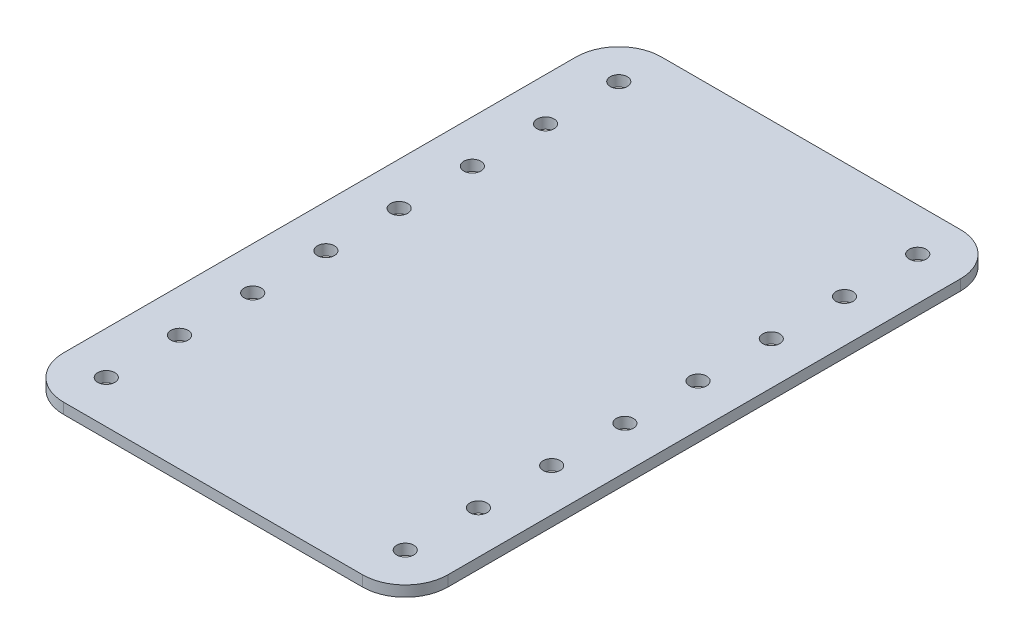
ISO-10303-21;
HEADER;
FILE_DESCRIPTION(('STEP AP214'),'2;1');
FILE_NAME('part.step','',(''),(''),'','','');
FILE_SCHEMA(('AUTOMOTIVE_DESIGN { 1 0 10303 214 1 1 1 1 }'));
ENDSEC;
DATA;
#1=APPLICATION_CONTEXT('core data for automotive mechanical design processes');
#2=APPLICATION_PROTOCOL_DEFINITION('international standard','automotive_design',2000,#1);
#3=PRODUCT_CONTEXT('',#1,'mechanical');
#4=PRODUCT('Part','Part','',(#3));
#5=PRODUCT_RELATED_PRODUCT_CATEGORY('part','',(#4));
#6=PRODUCT_DEFINITION_FORMATION('','',#4);
#7=PRODUCT_DEFINITION_CONTEXT('part definition',#1,'design');
#8=PRODUCT_DEFINITION('design','',#6,#7);
#9=PRODUCT_DEFINITION_SHAPE('','',#8);
#10=(LENGTH_UNIT() NAMED_UNIT(*) SI_UNIT(.MILLI.,.METRE.));
#11=(NAMED_UNIT(*) PLANE_ANGLE_UNIT() SI_UNIT($,.RADIAN.));
#12=(NAMED_UNIT(*) SI_UNIT($,.STERADIAN.) SOLID_ANGLE_UNIT());
#13=UNCERTAINTY_MEASURE_WITH_UNIT(LENGTH_MEASURE(1.E-05),#10,'distance_accuracy_value','');
#14=(GEOMETRIC_REPRESENTATION_CONTEXT(3) GLOBAL_UNCERTAINTY_ASSIGNED_CONTEXT((#13)) GLOBAL_UNIT_ASSIGNED_CONTEXT((#10,
#11,#12)) REPRESENTATION_CONTEXT('',''));
#15=CARTESIAN_POINT('',(0.,0.,0.));
#16=DIRECTION('',(0.,0.,1.));
#17=DIRECTION('',(1.,0.,0.));
#18=AXIS2_PLACEMENT_3D('',#15,#16,#17);
#19=CARTESIAN_POINT('',(57.15,3.175,88.9));
#20=DIRECTION('',(-1.,0.,0.));
#21=DIRECTION('',(0.,0.,1.));
#22=AXIS2_PLACEMENT_3D('',#19,#20,#21);
#23=PLANE('',#22);
#24=DIRECTION('',(0.,0.,-1.));
#25=VECTOR('',#24,1.);
#26=CARTESIAN_POINT('',(57.15,0.,88.9));
#27=LINE('',#26,#25);
#28=CARTESIAN_POINT('',(57.15,0.,76.2));
#29=VERTEX_POINT('',#28);
#30=CARTESIAN_POINT('',(57.15,0.,-76.2));
#31=VERTEX_POINT('',#30);
#32=EDGE_CURVE('E127',#29,#31,#27,.T.);
#33=ORIENTED_EDGE('',*,*,#32,.T.);
#34=DIRECTION('',(0.,-1.,0.));
#35=VECTOR('',#34,1.);
#36=CARTESIAN_POINT('',(57.15,3.175,-76.2));
#37=LINE('',#36,#35);
#38=CARTESIAN_POINT('',(57.15,3.175,-76.2));
#39=VERTEX_POINT('',#38);
#40=EDGE_CURVE('E150',#31,#39,#37,.F.);
#41=ORIENTED_EDGE('',*,*,#40,.T.);
#42=DIRECTION('',(0.,0.,-1.));
#43=VECTOR('',#42,1.);
#44=CARTESIAN_POINT('',(57.15,3.175,88.9));
#45=LINE('',#44,#43);
#46=CARTESIAN_POINT('',(57.15,3.175,76.2));
#47=VERTEX_POINT('',#46);
#48=EDGE_CURVE('E125',#47,#39,#45,.T.);
#49=ORIENTED_EDGE('',*,*,#48,.F.);
#50=DIRECTION('',(0.,-1.,0.));
#51=VECTOR('',#50,1.);
#52=CARTESIAN_POINT('',(57.15,3.175,76.2));
#53=LINE('',#52,#51);
#54=EDGE_CURVE('E147',#47,#29,#53,.T.);
#55=ORIENTED_EDGE('',*,*,#54,.T.);
#56=EDGE_LOOP('',(#33,#41,#49,#55));
#57=FACE_BOUND('',#56,.T.);
#58=ADVANCED_FACE('F32',(#57),#23,.F.);
#59=CARTESIAN_POINT('',(-57.15,3.175,-88.9));
#60=DIRECTION('',(0.,0.,1.));
#61=DIRECTION('',(1.,0.,0.));
#62=AXIS2_PLACEMENT_3D('',#59,#60,#61);
#63=PLANE('',#62);
#64=DIRECTION('',(-1.,0.,0.));
#65=VECTOR('',#64,1.);
#66=CARTESIAN_POINT('',(-57.15,0.,-88.9));
#67=LINE('',#66,#65);
#68=CARTESIAN_POINT('',(44.45,0.,-88.9));
#69=VERTEX_POINT('',#68);
#70=CARTESIAN_POINT('',(-44.45,0.,-88.9));
#71=VERTEX_POINT('',#70);
#72=EDGE_CURVE('E123',#69,#71,#67,.T.);
#73=ORIENTED_EDGE('',*,*,#72,.T.);
#74=DIRECTION('',(0.,-1.,0.));
#75=VECTOR('',#74,1.);
#76=CARTESIAN_POINT('',(-44.45,3.175,-88.9));
#77=LINE('',#76,#75);
#78=CARTESIAN_POINT('',(-44.45,3.175,-88.9));
#79=VERTEX_POINT('',#78);
#80=EDGE_CURVE('E102',#71,#79,#77,.F.);
#81=ORIENTED_EDGE('',*,*,#80,.T.);
#82=DIRECTION('',(-1.,0.,0.));
#83=VECTOR('',#82,1.);
#84=CARTESIAN_POINT('',(-57.15,3.175,-88.9));
#85=LINE('',#84,#83);
#86=CARTESIAN_POINT('',(44.45,3.175,-88.9));
#87=VERTEX_POINT('',#86);
#88=EDGE_CURVE('E166',#87,#79,#85,.T.);
#89=ORIENTED_EDGE('',*,*,#88,.F.);
#90=DIRECTION('',(0.,-1.,0.));
#91=VECTOR('',#90,1.);
#92=CARTESIAN_POINT('',(44.45,3.175,-88.9));
#93=LINE('',#92,#91);
#94=EDGE_CURVE('E107',#87,#69,#93,.T.);
#95=ORIENTED_EDGE('',*,*,#94,.T.);
#96=EDGE_LOOP('',(#73,#81,#89,#95));
#97=FACE_BOUND('',#96,.T.);
#98=ADVANCED_FACE('F317',(#97),#63,.F.);
#99=CARTESIAN_POINT('',(-57.15,3.175,88.9));
#100=DIRECTION('',(1.,0.,0.));
#101=DIRECTION('',(0.,0.,-1.));
#102=AXIS2_PLACEMENT_3D('',#99,#100,#101);
#103=PLANE('',#102);
#104=DIRECTION('',(0.,0.,1.));
#105=VECTOR('',#104,1.);
#106=CARTESIAN_POINT('',(-57.15,3.175,88.9));
#107=LINE('',#106,#105);
#108=CARTESIAN_POINT('',(-57.15,3.175,-76.2));
#109=VERTEX_POINT('',#108);
#110=CARTESIAN_POINT('',(-57.15,3.175,76.2));
#111=VERTEX_POINT('',#110);
#112=EDGE_CURVE('E116',#109,#111,#107,.T.);
#113=ORIENTED_EDGE('',*,*,#112,.F.);
#114=DIRECTION('',(0.,-1.,0.));
#115=VECTOR('',#114,1.);
#116=CARTESIAN_POINT('',(-57.15,3.175,-76.2));
#117=LINE('',#116,#115);
#118=CARTESIAN_POINT('',(-57.15,0.,-76.2));
#119=VERTEX_POINT('',#118);
#120=EDGE_CURVE('E101',#109,#119,#117,.T.);
#121=ORIENTED_EDGE('',*,*,#120,.T.);
#122=DIRECTION('',(0.,0.,1.));
#123=VECTOR('',#122,1.);
#124=CARTESIAN_POINT('',(-57.15,0.,88.9));
#125=LINE('',#124,#123);
#126=CARTESIAN_POINT('',(-57.15,0.,76.2));
#127=VERTEX_POINT('',#126);
#128=EDGE_CURVE('E114',#119,#127,#125,.T.);
#129=ORIENTED_EDGE('',*,*,#128,.T.);
#130=DIRECTION('',(0.,-1.,0.));
#131=VECTOR('',#130,1.);
#132=CARTESIAN_POINT('',(-57.15,3.175,76.2));
#133=LINE('',#132,#131);
#134=EDGE_CURVE('E118',#127,#111,#133,.F.);
#135=ORIENTED_EDGE('',*,*,#134,.T.);
#136=EDGE_LOOP('',(#113,#121,#129,#135));
#137=FACE_BOUND('',#136,.T.);
#138=ADVANCED_FACE('F113',(#137),#103,.F.);
#139=CARTESIAN_POINT('',(-57.15,3.175,88.9));
#140=DIRECTION('',(0.,0.,-1.));
#141=DIRECTION('',(-1.,0.,0.));
#142=AXIS2_PLACEMENT_3D('',#139,#140,#141);
#143=PLANE('',#142);
#144=DIRECTION('',(1.,0.,0.));
#145=VECTOR('',#144,1.);
#146=CARTESIAN_POINT('',(-57.15,0.,88.9));
#147=LINE('',#146,#145);
#148=CARTESIAN_POINT('',(-44.45,0.,88.9));
#149=VERTEX_POINT('',#148);
#150=CARTESIAN_POINT('',(44.45,0.,88.9));
#151=VERTEX_POINT('',#150);
#152=EDGE_CURVE('E122',#149,#151,#147,.T.);
#153=ORIENTED_EDGE('',*,*,#152,.T.);
#154=DIRECTION('',(0.,-1.,0.));
#155=VECTOR('',#154,1.);
#156=CARTESIAN_POINT('',(44.45,3.175,88.9));
#157=LINE('',#156,#155);
#158=CARTESIAN_POINT('',(44.45,3.175,88.9));
#159=VERTEX_POINT('',#158);
#160=EDGE_CURVE('E11',#151,#159,#157,.F.);
#161=ORIENTED_EDGE('',*,*,#160,.T.);
#162=DIRECTION('',(1.,0.,0.));
#163=VECTOR('',#162,1.);
#164=CARTESIAN_POINT('',(-57.15,3.175,88.9));
#165=LINE('',#164,#163);
#166=CARTESIAN_POINT('',(-44.45,3.175,88.9));
#167=VERTEX_POINT('',#166);
#168=EDGE_CURVE('E131',#167,#159,#165,.T.);
#169=ORIENTED_EDGE('',*,*,#168,.F.);
#170=DIRECTION('',(0.,-1.,0.));
#171=VECTOR('',#170,1.);
#172=CARTESIAN_POINT('',(-44.45,3.175,88.9));
#173=LINE('',#172,#171);
#174=EDGE_CURVE('E40',#167,#149,#173,.T.);
#175=ORIENTED_EDGE('',*,*,#174,.T.);
#176=EDGE_LOOP('',(#153,#161,#169,#175));
#177=FACE_BOUND('',#176,.T.);
#178=ADVANCED_FACE('F153',(#177),#143,.F.);
#179=CARTESIAN_POINT('',(0.,3.175,0.));
#180=DIRECTION('',(0.,-1.,0.));
#181=DIRECTION('',(0.,0.,-1.));
#182=AXIS2_PLACEMENT_3D('',#179,#180,#181);
#183=PLANE('',#182);
#184=CARTESIAN_POINT('',(44.45,3.175,-76.2));
#185=DIRECTION('',(0.,1.,0.));
#186=DIRECTION('',(0.,0.,-1.));
#187=AXIS2_PLACEMENT_3D('',#184,#185,#186);
#188=CIRCLE('',#187,2.54);
#189=CARTESIAN_POINT('',(44.45,3.175,-78.74));
#190=VERTEX_POINT('',#189);
#191=EDGE_CURVE('E266',#190,#190,#188,.T.);
#192=ORIENTED_EDGE('',*,*,#191,.F.);
#193=EDGE_LOOP('',(#192));
#194=FACE_BOUND('',#193,.T.);
#195=CARTESIAN_POINT('',(44.4499999999998,3.175,-54.4285714285714));
#196=DIRECTION('',(0.,1.,0.));
#197=DIRECTION('',(0.,0.,-1.));
#198=AXIS2_PLACEMENT_3D('',#195,#196,#197);
#199=CIRCLE('',#198,2.53999999999999);
#200=CARTESIAN_POINT('',(44.4499999999998,3.175,-56.9685714285714));
#201=VERTEX_POINT('',#200);
#202=EDGE_CURVE('E260',#201,#201,#199,.T.);
#203=ORIENTED_EDGE('',*,*,#202,.F.);
#204=EDGE_LOOP('',(#203));
#205=FACE_BOUND('',#204,.T.);
#206=CARTESIAN_POINT('',(44.4499999999995,3.175,-32.6571428571428));
#207=DIRECTION('',(0.,1.,0.));
#208=DIRECTION('',(0.,0.,-1.));
#209=AXIS2_PLACEMENT_3D('',#206,#207,#208);
#210=CIRCLE('',#209,2.54);
#211=CARTESIAN_POINT('',(44.4499999999995,3.175,-35.1971428571428));
#212=VERTEX_POINT('',#211);
#213=EDGE_CURVE('E254',#212,#212,#210,.T.);
#214=ORIENTED_EDGE('',*,*,#213,.F.);
#215=EDGE_LOOP('',(#214));
#216=FACE_BOUND('',#215,.T.);
#217=CARTESIAN_POINT('',(44.4499999999993,3.175,-10.8857142857143));
#218=DIRECTION('',(0.,1.,0.));
#219=DIRECTION('',(0.,0.,-1.));
#220=AXIS2_PLACEMENT_3D('',#217,#218,#219);
#221=CIRCLE('',#220,2.54);
#222=CARTESIAN_POINT('',(44.4499999999993,3.175,-13.4257142857143));
#223=VERTEX_POINT('',#222);
#224=EDGE_CURVE('E248',#223,#223,#221,.T.);
#225=ORIENTED_EDGE('',*,*,#224,.F.);
#226=EDGE_LOOP('',(#225));
#227=FACE_BOUND('',#226,.T.);
#228=CARTESIAN_POINT('',(44.4499999999991,3.175,10.8857142857143));
#229=DIRECTION('',(0.,1.,0.));
#230=DIRECTION('',(0.,0.,-1.));
#231=AXIS2_PLACEMENT_3D('',#228,#229,#230);
#232=CIRCLE('',#231,2.54);
#233=CARTESIAN_POINT('',(44.4499999999991,3.175,8.34571428571429));
#234=VERTEX_POINT('',#233);
#235=EDGE_CURVE('E242',#234,#234,#232,.T.);
#236=ORIENTED_EDGE('',*,*,#235,.F.);
#237=EDGE_LOOP('',(#236));
#238=FACE_BOUND('',#237,.T.);
#239=CARTESIAN_POINT('',(44.4499999999989,3.175,32.6571428571429));
#240=DIRECTION('',(0.,1.,0.));
#241=DIRECTION('',(0.,0.,-1.));
#242=AXIS2_PLACEMENT_3D('',#239,#240,#241);
#243=CIRCLE('',#242,2.54);
#244=CARTESIAN_POINT('',(44.4499999999989,3.175,30.1171428571429));
#245=VERTEX_POINT('',#244);
#246=EDGE_CURVE('E236',#245,#245,#243,.T.);
#247=ORIENTED_EDGE('',*,*,#246,.F.);
#248=EDGE_LOOP('',(#247));
#249=FACE_BOUND('',#248,.T.);
#250=CARTESIAN_POINT('',(44.4499999999986,3.175,54.4285714285714));
#251=DIRECTION('',(0.,1.,0.));
#252=DIRECTION('',(0.,0.,-1.));
#253=AXIS2_PLACEMENT_3D('',#250,#251,#252);
#254=CIRCLE('',#253,2.54);
#255=CARTESIAN_POINT('',(44.4499999999986,3.175,51.8885714285714));
#256=VERTEX_POINT('',#255);
#257=EDGE_CURVE('E230',#256,#256,#254,.T.);
#258=ORIENTED_EDGE('',*,*,#257,.F.);
#259=EDGE_LOOP('',(#258));
#260=FACE_BOUND('',#259,.T.);
#261=CARTESIAN_POINT('',(44.4499999999983,3.175,76.2));
#262=DIRECTION('',(0.,1.,0.));
#263=DIRECTION('',(0.,0.,-1.));
#264=AXIS2_PLACEMENT_3D('',#261,#262,#263);
#265=CIRCLE('',#264,2.54);
#266=CARTESIAN_POINT('',(44.4499999999983,3.175,73.66));
#267=VERTEX_POINT('',#266);
#268=EDGE_CURVE('E224',#267,#267,#265,.T.);
#269=ORIENTED_EDGE('',*,*,#268,.F.);
#270=EDGE_LOOP('',(#269));
#271=FACE_BOUND('',#270,.T.);
#272=CARTESIAN_POINT('',(-44.4499999999983,3.175,76.2));
#273=DIRECTION('',(0.,1.,0.));
#274=DIRECTION('',(0.,0.,1.));
#275=AXIS2_PLACEMENT_3D('',#272,#273,#274);
#276=CIRCLE('',#275,2.54);
#277=CARTESIAN_POINT('',(-44.4499999999983,3.175,78.74));
#278=VERTEX_POINT('',#277);
#279=EDGE_CURVE('E218',#278,#278,#276,.T.);
#280=ORIENTED_EDGE('',*,*,#279,.F.);
#281=EDGE_LOOP('',(#280));
#282=FACE_BOUND('',#281,.T.);
#283=CARTESIAN_POINT('',(-44.4499999999986,3.175,54.4285714285714));
#284=DIRECTION('',(0.,1.,0.));
#285=DIRECTION('',(0.,0.,1.));
#286=AXIS2_PLACEMENT_3D('',#283,#284,#285);
#287=CIRCLE('',#286,2.54);
#288=CARTESIAN_POINT('',(-44.4499999999986,3.175,56.9685714285714));
#289=VERTEX_POINT('',#288);
#290=EDGE_CURVE('E212',#289,#289,#287,.T.);
#291=ORIENTED_EDGE('',*,*,#290,.F.);
#292=EDGE_LOOP('',(#291));
#293=FACE_BOUND('',#292,.T.);
#294=CARTESIAN_POINT('',(-44.4499999999989,3.175,32.6571428571429));
#295=DIRECTION('',(0.,1.,0.));
#296=DIRECTION('',(0.,0.,1.));
#297=AXIS2_PLACEMENT_3D('',#294,#295,#296);
#298=CIRCLE('',#297,2.54);
#299=CARTESIAN_POINT('',(-44.4499999999989,3.175,35.1971428571429));
#300=VERTEX_POINT('',#299);
#301=EDGE_CURVE('E206',#300,#300,#298,.T.);
#302=ORIENTED_EDGE('',*,*,#301,.F.);
#303=EDGE_LOOP('',(#302));
#304=FACE_BOUND('',#303,.T.);
#305=CARTESIAN_POINT('',(-44.4499999999991,3.175,10.8857142857143));
#306=DIRECTION('',(0.,1.,0.));
#307=DIRECTION('',(0.,0.,1.));
#308=AXIS2_PLACEMENT_3D('',#305,#306,#307);
#309=CIRCLE('',#308,2.54);
#310=CARTESIAN_POINT('',(-44.4499999999991,3.175,13.4257142857143));
#311=VERTEX_POINT('',#310);
#312=EDGE_CURVE('E200',#311,#311,#309,.T.);
#313=ORIENTED_EDGE('',*,*,#312,.F.);
#314=EDGE_LOOP('',(#313));
#315=FACE_BOUND('',#314,.T.);
#316=CARTESIAN_POINT('',(-44.4499999999993,3.175,-10.8857142857143));
#317=DIRECTION('',(0.,1.,0.));
#318=DIRECTION('',(0.,0.,1.));
#319=AXIS2_PLACEMENT_3D('',#316,#317,#318);
#320=CIRCLE('',#319,2.54);
#321=CARTESIAN_POINT('',(-44.4499999999993,3.175,-8.34571428571427));
#322=VERTEX_POINT('',#321);
#323=EDGE_CURVE('E194',#322,#322,#320,.T.);
#324=ORIENTED_EDGE('',*,*,#323,.F.);
#325=EDGE_LOOP('',(#324));
#326=FACE_BOUND('',#325,.T.);
#327=CARTESIAN_POINT('',(-44.4499999999995,3.175,-32.6571428571428));
#328=DIRECTION('',(0.,1.,0.));
#329=DIRECTION('',(0.,0.,1.));
#330=AXIS2_PLACEMENT_3D('',#327,#328,#329);
#331=CIRCLE('',#330,2.54);
#332=CARTESIAN_POINT('',(-44.4499999999995,3.175,-30.1171428571428));
#333=VERTEX_POINT('',#332);
#334=EDGE_CURVE('E188',#333,#333,#331,.T.);
#335=ORIENTED_EDGE('',*,*,#334,.F.);
#336=EDGE_LOOP('',(#335));
#337=FACE_BOUND('',#336,.T.);
#338=CARTESIAN_POINT('',(-44.4499999999998,3.175,-54.4285714285714));
#339=DIRECTION('',(0.,1.,0.));
#340=DIRECTION('',(0.,0.,1.));
#341=AXIS2_PLACEMENT_3D('',#338,#339,#340);
#342=CIRCLE('',#341,2.53999999999999);
#343=CARTESIAN_POINT('',(-44.4499999999998,3.175,-51.8885714285714));
#344=VERTEX_POINT('',#343);
#345=EDGE_CURVE('E182',#344,#344,#342,.T.);
#346=ORIENTED_EDGE('',*,*,#345,.F.);
#347=EDGE_LOOP('',(#346));
#348=FACE_BOUND('',#347,.T.);
#349=CARTESIAN_POINT('',(-44.45,3.175,-76.2));
#350=DIRECTION('',(0.,1.,0.));
#351=DIRECTION('',(0.,0.,1.));
#352=AXIS2_PLACEMENT_3D('',#349,#350,#351);
#353=CIRCLE('',#352,2.54);
#354=CARTESIAN_POINT('',(-44.45,3.175,-73.66));
#355=VERTEX_POINT('',#354);
#356=EDGE_CURVE('E171',#355,#355,#353,.T.);
#357=ORIENTED_EDGE('',*,*,#356,.F.);
#358=EDGE_LOOP('',(#357));
#359=FACE_BOUND('',#358,.T.);
#360=ORIENTED_EDGE('',*,*,#88,.T.);
#361=CARTESIAN_POINT('',(-44.45,3.175,-76.2));
#362=DIRECTION('',(0.,-1.,0.));
#363=DIRECTION('',(0.,0.,-1.));
#364=AXIS2_PLACEMENT_3D('',#361,#362,#363);
#365=CIRCLE('',#364,12.7);
#366=EDGE_CURVE('E145',#79,#109,#365,.F.);
#367=ORIENTED_EDGE('',*,*,#366,.T.);
#368=ORIENTED_EDGE('',*,*,#112,.T.);
#369=CARTESIAN_POINT('',(-44.45,3.175,76.2));
#370=DIRECTION('',(0.,-1.,0.));
#371=DIRECTION('',(0.,0.,-1.));
#372=AXIS2_PLACEMENT_3D('',#369,#370,#371);
#373=CIRCLE('',#372,12.7);
#374=EDGE_CURVE('E52',#111,#167,#373,.F.);
#375=ORIENTED_EDGE('',*,*,#374,.T.);
#376=ORIENTED_EDGE('',*,*,#168,.T.);
#377=CARTESIAN_POINT('',(44.45,3.175,76.2));
#378=DIRECTION('',(0.,-1.,0.));
#379=DIRECTION('',(0.,0.,-1.));
#380=AXIS2_PLACEMENT_3D('',#377,#378,#379);
#381=CIRCLE('',#380,12.7);
#382=EDGE_CURVE('E141',#159,#47,#381,.F.);
#383=ORIENTED_EDGE('',*,*,#382,.T.);
#384=ORIENTED_EDGE('',*,*,#48,.T.);
#385=CARTESIAN_POINT('',(44.45,3.175,-76.2));
#386=DIRECTION('',(0.,-1.,0.));
#387=DIRECTION('',(0.,0.,-1.));
#388=AXIS2_PLACEMENT_3D('',#385,#386,#387);
#389=CIRCLE('',#388,12.7);
#390=EDGE_CURVE('E143',#39,#87,#389,.F.);
#391=ORIENTED_EDGE('',*,*,#390,.T.);
#392=EDGE_LOOP('',(#360,#367,#368,#375,#376,#383,#384,#391));
#393=FACE_BOUND('',#392,.T.);
#394=ADVANCED_FACE('F281',(#194,#205,#216,#227,#238,#249,#260,#271,#282,#293,#304,#315,#326,
#337,#348,#359,#393),#183,.F.);
#395=CARTESIAN_POINT('',(0.,0.,0.));
#396=DIRECTION('',(0.,-1.,0.));
#397=DIRECTION('',(0.,0.,-1.));
#398=AXIS2_PLACEMENT_3D('',#395,#396,#397);
#399=PLANE('',#398);
#400=CARTESIAN_POINT('',(44.45,0.,-76.2));
#401=DIRECTION('',(0.,1.,0.));
#402=DIRECTION('',(0.,0.,-1.));
#403=AXIS2_PLACEMENT_3D('',#400,#401,#402);
#404=CIRCLE('',#403,2.54);
#405=CARTESIAN_POINT('',(44.45,0.,-78.74));
#406=VERTEX_POINT('',#405);
#407=EDGE_CURVE('E263',#406,#406,#404,.T.);
#408=ORIENTED_EDGE('',*,*,#407,.T.);
#409=EDGE_LOOP('',(#408));
#410=FACE_BOUND('',#409,.T.);
#411=CARTESIAN_POINT('',(44.4499999999998,0.,-54.4285714285714));
#412=DIRECTION('',(0.,1.,0.));
#413=DIRECTION('',(0.,0.,-1.));
#414=AXIS2_PLACEMENT_3D('',#411,#412,#413);
#415=CIRCLE('',#414,2.53999999999999);
#416=CARTESIAN_POINT('',(44.4499999999998,0.,-56.9685714285714));
#417=VERTEX_POINT('',#416);
#418=EDGE_CURVE('E257',#417,#417,#415,.T.);
#419=ORIENTED_EDGE('',*,*,#418,.T.);
#420=EDGE_LOOP('',(#419));
#421=FACE_BOUND('',#420,.T.);
#422=CARTESIAN_POINT('',(44.4499999999995,0.,-32.6571428571428));
#423=DIRECTION('',(0.,1.,0.));
#424=DIRECTION('',(0.,0.,-1.));
#425=AXIS2_PLACEMENT_3D('',#422,#423,#424);
#426=CIRCLE('',#425,2.54);
#427=CARTESIAN_POINT('',(44.4499999999995,0.,-35.1971428571428));
#428=VERTEX_POINT('',#427);
#429=EDGE_CURVE('E251',#428,#428,#426,.T.);
#430=ORIENTED_EDGE('',*,*,#429,.T.);
#431=EDGE_LOOP('',(#430));
#432=FACE_BOUND('',#431,.T.);
#433=CARTESIAN_POINT('',(44.4499999999993,0.,-10.8857142857143));
#434=DIRECTION('',(0.,1.,0.));
#435=DIRECTION('',(0.,0.,-1.));
#436=AXIS2_PLACEMENT_3D('',#433,#434,#435);
#437=CIRCLE('',#436,2.54);
#438=CARTESIAN_POINT('',(44.4499999999993,0.,-13.4257142857143));
#439=VERTEX_POINT('',#438);
#440=EDGE_CURVE('E245',#439,#439,#437,.T.);
#441=ORIENTED_EDGE('',*,*,#440,.T.);
#442=EDGE_LOOP('',(#441));
#443=FACE_BOUND('',#442,.T.);
#444=CARTESIAN_POINT('',(44.4499999999991,0.,10.8857142857143));
#445=DIRECTION('',(0.,1.,0.));
#446=DIRECTION('',(0.,0.,-1.));
#447=AXIS2_PLACEMENT_3D('',#444,#445,#446);
#448=CIRCLE('',#447,2.54);
#449=CARTESIAN_POINT('',(44.4499999999991,0.,8.34571428571429));
#450=VERTEX_POINT('',#449);
#451=EDGE_CURVE('E239',#450,#450,#448,.T.);
#452=ORIENTED_EDGE('',*,*,#451,.T.);
#453=EDGE_LOOP('',(#452));
#454=FACE_BOUND('',#453,.T.);
#455=CARTESIAN_POINT('',(44.4499999999989,0.,32.6571428571429));
#456=DIRECTION('',(0.,1.,0.));
#457=DIRECTION('',(0.,0.,-1.));
#458=AXIS2_PLACEMENT_3D('',#455,#456,#457);
#459=CIRCLE('',#458,2.54);
#460=CARTESIAN_POINT('',(44.4499999999989,0.,30.1171428571429));
#461=VERTEX_POINT('',#460);
#462=EDGE_CURVE('E233',#461,#461,#459,.T.);
#463=ORIENTED_EDGE('',*,*,#462,.T.);
#464=EDGE_LOOP('',(#463));
#465=FACE_BOUND('',#464,.T.);
#466=CARTESIAN_POINT('',(44.4499999999986,0.,54.4285714285714));
#467=DIRECTION('',(0.,1.,0.));
#468=DIRECTION('',(0.,0.,-1.));
#469=AXIS2_PLACEMENT_3D('',#466,#467,#468);
#470=CIRCLE('',#469,2.54);
#471=CARTESIAN_POINT('',(44.4499999999986,0.,51.8885714285714));
#472=VERTEX_POINT('',#471);
#473=EDGE_CURVE('E227',#472,#472,#470,.T.);
#474=ORIENTED_EDGE('',*,*,#473,.T.);
#475=EDGE_LOOP('',(#474));
#476=FACE_BOUND('',#475,.T.);
#477=CARTESIAN_POINT('',(44.4499999999983,0.,76.2));
#478=DIRECTION('',(0.,1.,0.));
#479=DIRECTION('',(0.,0.,-1.));
#480=AXIS2_PLACEMENT_3D('',#477,#478,#479);
#481=CIRCLE('',#480,2.54);
#482=CARTESIAN_POINT('',(44.4499999999983,0.,73.66));
#483=VERTEX_POINT('',#482);
#484=EDGE_CURVE('E221',#483,#483,#481,.T.);
#485=ORIENTED_EDGE('',*,*,#484,.T.);
#486=EDGE_LOOP('',(#485));
#487=FACE_BOUND('',#486,.T.);
#488=CARTESIAN_POINT('',(-44.4499999999983,0.,76.2));
#489=DIRECTION('',(0.,1.,0.));
#490=DIRECTION('',(0.,0.,1.));
#491=AXIS2_PLACEMENT_3D('',#488,#489,#490);
#492=CIRCLE('',#491,2.54);
#493=CARTESIAN_POINT('',(-44.4499999999983,0.,78.74));
#494=VERTEX_POINT('',#493);
#495=EDGE_CURVE('E215',#494,#494,#492,.T.);
#496=ORIENTED_EDGE('',*,*,#495,.T.);
#497=EDGE_LOOP('',(#496));
#498=FACE_BOUND('',#497,.T.);
#499=CARTESIAN_POINT('',(-44.4499999999986,0.,54.4285714285714));
#500=DIRECTION('',(0.,1.,0.));
#501=DIRECTION('',(0.,0.,1.));
#502=AXIS2_PLACEMENT_3D('',#499,#500,#501);
#503=CIRCLE('',#502,2.54);
#504=CARTESIAN_POINT('',(-44.4499999999986,0.,56.9685714285714));
#505=VERTEX_POINT('',#504);
#506=EDGE_CURVE('E209',#505,#505,#503,.T.);
#507=ORIENTED_EDGE('',*,*,#506,.T.);
#508=EDGE_LOOP('',(#507));
#509=FACE_BOUND('',#508,.T.);
#510=CARTESIAN_POINT('',(-44.4499999999989,0.,32.6571428571429));
#511=DIRECTION('',(0.,1.,0.));
#512=DIRECTION('',(0.,0.,1.));
#513=AXIS2_PLACEMENT_3D('',#510,#511,#512);
#514=CIRCLE('',#513,2.54);
#515=CARTESIAN_POINT('',(-44.4499999999989,0.,35.1971428571429));
#516=VERTEX_POINT('',#515);
#517=EDGE_CURVE('E203',#516,#516,#514,.T.);
#518=ORIENTED_EDGE('',*,*,#517,.T.);
#519=EDGE_LOOP('',(#518));
#520=FACE_BOUND('',#519,.T.);
#521=CARTESIAN_POINT('',(-44.4499999999991,0.,10.8857142857143));
#522=DIRECTION('',(0.,1.,0.));
#523=DIRECTION('',(0.,0.,1.));
#524=AXIS2_PLACEMENT_3D('',#521,#522,#523);
#525=CIRCLE('',#524,2.54);
#526=CARTESIAN_POINT('',(-44.4499999999991,0.,13.4257142857143));
#527=VERTEX_POINT('',#526);
#528=EDGE_CURVE('E197',#527,#527,#525,.T.);
#529=ORIENTED_EDGE('',*,*,#528,.T.);
#530=EDGE_LOOP('',(#529));
#531=FACE_BOUND('',#530,.T.);
#532=CARTESIAN_POINT('',(-44.4499999999993,0.,-10.8857142857143));
#533=DIRECTION('',(0.,1.,0.));
#534=DIRECTION('',(0.,0.,1.));
#535=AXIS2_PLACEMENT_3D('',#532,#533,#534);
#536=CIRCLE('',#535,2.54);
#537=CARTESIAN_POINT('',(-44.4499999999993,0.,-8.34571428571427));
#538=VERTEX_POINT('',#537);
#539=EDGE_CURVE('E191',#538,#538,#536,.T.);
#540=ORIENTED_EDGE('',*,*,#539,.T.);
#541=EDGE_LOOP('',(#540));
#542=FACE_BOUND('',#541,.T.);
#543=CARTESIAN_POINT('',(-44.4499999999995,0.,-32.6571428571428));
#544=DIRECTION('',(0.,1.,0.));
#545=DIRECTION('',(0.,0.,1.));
#546=AXIS2_PLACEMENT_3D('',#543,#544,#545);
#547=CIRCLE('',#546,2.54);
#548=CARTESIAN_POINT('',(-44.4499999999995,0.,-30.1171428571428));
#549=VERTEX_POINT('',#548);
#550=EDGE_CURVE('E185',#549,#549,#547,.T.);
#551=ORIENTED_EDGE('',*,*,#550,.T.);
#552=EDGE_LOOP('',(#551));
#553=FACE_BOUND('',#552,.T.);
#554=CARTESIAN_POINT('',(-44.4499999999998,0.,-54.4285714285714));
#555=DIRECTION('',(0.,1.,0.));
#556=DIRECTION('',(0.,0.,1.));
#557=AXIS2_PLACEMENT_3D('',#554,#555,#556);
#558=CIRCLE('',#557,2.53999999999999);
#559=CARTESIAN_POINT('',(-44.4499999999998,0.,-51.8885714285714));
#560=VERTEX_POINT('',#559);
#561=EDGE_CURVE('E180',#560,#560,#558,.T.);
#562=ORIENTED_EDGE('',*,*,#561,.T.);
#563=EDGE_LOOP('',(#562));
#564=FACE_BOUND('',#563,.T.);
#565=CARTESIAN_POINT('',(-44.45,0.,-76.2));
#566=DIRECTION('',(0.,1.,0.));
#567=DIRECTION('',(0.,0.,1.));
#568=AXIS2_PLACEMENT_3D('',#565,#566,#567);
#569=CIRCLE('',#568,2.54);
#570=CARTESIAN_POINT('',(-44.45,0.,-73.66));
#571=VERTEX_POINT('',#570);
#572=EDGE_CURVE('E175',#571,#571,#569,.T.);
#573=ORIENTED_EDGE('',*,*,#572,.T.);
#574=EDGE_LOOP('',(#573));
#575=FACE_BOUND('',#574,.T.);
#576=ORIENTED_EDGE('',*,*,#128,.F.);
#577=CARTESIAN_POINT('',(-44.45,0.,-76.2));
#578=DIRECTION('',(0.,-1.,0.));
#579=DIRECTION('',(0.,0.,-1.));
#580=AXIS2_PLACEMENT_3D('',#577,#578,#579);
#581=CIRCLE('',#580,12.7);
#582=EDGE_CURVE('E97',#119,#71,#581,.T.);
#583=ORIENTED_EDGE('',*,*,#582,.T.);
#584=ORIENTED_EDGE('',*,*,#72,.F.);
#585=CARTESIAN_POINT('',(44.45,0.,-76.2));
#586=DIRECTION('',(0.,-1.,0.));
#587=DIRECTION('',(0.,0.,-1.));
#588=AXIS2_PLACEMENT_3D('',#585,#586,#587);
#589=CIRCLE('',#588,12.7);
#590=EDGE_CURVE('E108',#69,#31,#589,.T.);
#591=ORIENTED_EDGE('',*,*,#590,.T.);
#592=ORIENTED_EDGE('',*,*,#32,.F.);
#593=CARTESIAN_POINT('',(44.45,0.,76.2));
#594=DIRECTION('',(0.,-1.,0.));
#595=DIRECTION('',(0.,0.,-1.));
#596=AXIS2_PLACEMENT_3D('',#593,#594,#595);
#597=CIRCLE('',#596,12.7);
#598=EDGE_CURVE('E134',#29,#151,#597,.T.);
#599=ORIENTED_EDGE('',*,*,#598,.T.);
#600=ORIENTED_EDGE('',*,*,#152,.F.);
#601=CARTESIAN_POINT('',(-44.45,0.,76.2));
#602=DIRECTION('',(0.,-1.,0.));
#603=DIRECTION('',(0.,0.,-1.));
#604=AXIS2_PLACEMENT_3D('',#601,#602,#603);
#605=CIRCLE('',#604,12.7);
#606=EDGE_CURVE('E117',#149,#127,#605,.T.);
#607=ORIENTED_EDGE('',*,*,#606,.T.);
#608=EDGE_LOOP('',(#576,#583,#584,#591,#592,#599,#600,#607));
#609=FACE_BOUND('',#608,.T.);
#610=ADVANCED_FACE('F120',(#410,#421,#432,#443,#454,#465,#476,#487,#498,#509,#520,#531,#542,
#553,#564,#575,#609),#399,.T.);
#611=CARTESIAN_POINT('',(-44.45,0.,-76.2));
#612=DIRECTION('',(0.,1.,0.));
#613=DIRECTION('',(0.,0.,1.));
#614=AXIS2_PLACEMENT_3D('',#611,#612,#613);
#615=CYLINDRICAL_SURFACE('',#614,2.54);
#616=ORIENTED_EDGE('',*,*,#572,.F.);
#617=EDGE_LOOP('',(#616));
#618=FACE_BOUND('',#617,.T.);
#619=ORIENTED_EDGE('',*,*,#356,.T.);
#620=EDGE_LOOP('',(#619));
#621=FACE_BOUND('',#620,.T.);
#622=ADVANCED_FACE('F339',(#618,#621),#615,.F.);
#623=CARTESIAN_POINT('',(-44.4499999999998,0.,-54.4285714285714));
#624=DIRECTION('',(0.,1.,0.));
#625=DIRECTION('',(0.,0.,1.));
#626=AXIS2_PLACEMENT_3D('',#623,#624,#625);
#627=CYLINDRICAL_SURFACE('',#626,2.53999999999999);
#628=ORIENTED_EDGE('',*,*,#561,.F.);
#629=EDGE_LOOP('',(#628));
#630=FACE_BOUND('',#629,.T.);
#631=ORIENTED_EDGE('',*,*,#345,.T.);
#632=EDGE_LOOP('',(#631));
#633=FACE_BOUND('',#632,.T.);
#634=ADVANCED_FACE('F343',(#630,#633),#627,.F.);
#635=CARTESIAN_POINT('',(-44.4499999999995,0.,-32.6571428571428));
#636=DIRECTION('',(0.,1.,0.));
#637=DIRECTION('',(0.,0.,1.));
#638=AXIS2_PLACEMENT_3D('',#635,#636,#637);
#639=CYLINDRICAL_SURFACE('',#638,2.54);
#640=ORIENTED_EDGE('',*,*,#550,.F.);
#641=EDGE_LOOP('',(#640));
#642=FACE_BOUND('',#641,.T.);
#643=ORIENTED_EDGE('',*,*,#334,.T.);
#644=EDGE_LOOP('',(#643));
#645=FACE_BOUND('',#644,.T.);
#646=ADVANCED_FACE('F347',(#642,#645),#639,.F.);
#647=CARTESIAN_POINT('',(-44.4499999999993,0.,-10.8857142857143));
#648=DIRECTION('',(0.,1.,0.));
#649=DIRECTION('',(0.,0.,1.));
#650=AXIS2_PLACEMENT_3D('',#647,#648,#649);
#651=CYLINDRICAL_SURFACE('',#650,2.54);
#652=ORIENTED_EDGE('',*,*,#539,.F.);
#653=EDGE_LOOP('',(#652));
#654=FACE_BOUND('',#653,.T.);
#655=ORIENTED_EDGE('',*,*,#323,.T.);
#656=EDGE_LOOP('',(#655));
#657=FACE_BOUND('',#656,.T.);
#658=ADVANCED_FACE('F351',(#654,#657),#651,.F.);
#659=CARTESIAN_POINT('',(-44.4499999999991,0.,10.8857142857143));
#660=DIRECTION('',(0.,1.,0.));
#661=DIRECTION('',(0.,0.,1.));
#662=AXIS2_PLACEMENT_3D('',#659,#660,#661);
#663=CYLINDRICAL_SURFACE('',#662,2.54);
#664=ORIENTED_EDGE('',*,*,#528,.F.);
#665=EDGE_LOOP('',(#664));
#666=FACE_BOUND('',#665,.T.);
#667=ORIENTED_EDGE('',*,*,#312,.T.);
#668=EDGE_LOOP('',(#667));
#669=FACE_BOUND('',#668,.T.);
#670=ADVANCED_FACE('F355',(#666,#669),#663,.F.);
#671=CARTESIAN_POINT('',(-44.4499999999989,0.,32.6571428571429));
#672=DIRECTION('',(0.,1.,0.));
#673=DIRECTION('',(0.,0.,1.));
#674=AXIS2_PLACEMENT_3D('',#671,#672,#673);
#675=CYLINDRICAL_SURFACE('',#674,2.54);
#676=ORIENTED_EDGE('',*,*,#517,.F.);
#677=EDGE_LOOP('',(#676));
#678=FACE_BOUND('',#677,.T.);
#679=ORIENTED_EDGE('',*,*,#301,.T.);
#680=EDGE_LOOP('',(#679));
#681=FACE_BOUND('',#680,.T.);
#682=ADVANCED_FACE('F359',(#678,#681),#675,.F.);
#683=CARTESIAN_POINT('',(-44.4499999999986,0.,54.4285714285714));
#684=DIRECTION('',(0.,1.,0.));
#685=DIRECTION('',(0.,0.,1.));
#686=AXIS2_PLACEMENT_3D('',#683,#684,#685);
#687=CYLINDRICAL_SURFACE('',#686,2.54);
#688=ORIENTED_EDGE('',*,*,#506,.F.);
#689=EDGE_LOOP('',(#688));
#690=FACE_BOUND('',#689,.T.);
#691=ORIENTED_EDGE('',*,*,#290,.T.);
#692=EDGE_LOOP('',(#691));
#693=FACE_BOUND('',#692,.T.);
#694=ADVANCED_FACE('F363',(#690,#693),#687,.F.);
#695=CARTESIAN_POINT('',(-44.4499999999983,0.,76.2));
#696=DIRECTION('',(0.,1.,0.));
#697=DIRECTION('',(0.,0.,1.));
#698=AXIS2_PLACEMENT_3D('',#695,#696,#697);
#699=CYLINDRICAL_SURFACE('',#698,2.54);
#700=ORIENTED_EDGE('',*,*,#495,.F.);
#701=EDGE_LOOP('',(#700));
#702=FACE_BOUND('',#701,.T.);
#703=ORIENTED_EDGE('',*,*,#279,.T.);
#704=EDGE_LOOP('',(#703));
#705=FACE_BOUND('',#704,.T.);
#706=ADVANCED_FACE('F367',(#702,#705),#699,.F.);
#707=CARTESIAN_POINT('',(44.4499999999983,0.,76.2));
#708=DIRECTION('',(0.,1.,0.));
#709=DIRECTION('',(0.,0.,1.));
#710=AXIS2_PLACEMENT_3D('',#707,#708,#709);
#711=CYLINDRICAL_SURFACE('',#710,2.54);
#712=ORIENTED_EDGE('',*,*,#484,.F.);
#713=EDGE_LOOP('',(#712));
#714=FACE_BOUND('',#713,.T.);
#715=ORIENTED_EDGE('',*,*,#268,.T.);
#716=EDGE_LOOP('',(#715));
#717=FACE_BOUND('',#716,.T.);
#718=ADVANCED_FACE('F371',(#714,#717),#711,.F.);
#719=CARTESIAN_POINT('',(44.4499999999986,0.,54.4285714285714));
#720=DIRECTION('',(0.,1.,0.));
#721=DIRECTION('',(0.,0.,1.));
#722=AXIS2_PLACEMENT_3D('',#719,#720,#721);
#723=CYLINDRICAL_SURFACE('',#722,2.54);
#724=ORIENTED_EDGE('',*,*,#473,.F.);
#725=EDGE_LOOP('',(#724));
#726=FACE_BOUND('',#725,.T.);
#727=ORIENTED_EDGE('',*,*,#257,.T.);
#728=EDGE_LOOP('',(#727));
#729=FACE_BOUND('',#728,.T.);
#730=ADVANCED_FACE('F375',(#726,#729),#723,.F.);
#731=CARTESIAN_POINT('',(44.4499999999989,0.,32.6571428571429));
#732=DIRECTION('',(0.,1.,0.));
#733=DIRECTION('',(0.,0.,1.));
#734=AXIS2_PLACEMENT_3D('',#731,#732,#733);
#735=CYLINDRICAL_SURFACE('',#734,2.54);
#736=ORIENTED_EDGE('',*,*,#462,.F.);
#737=EDGE_LOOP('',(#736));
#738=FACE_BOUND('',#737,.T.);
#739=ORIENTED_EDGE('',*,*,#246,.T.);
#740=EDGE_LOOP('',(#739));
#741=FACE_BOUND('',#740,.T.);
#742=ADVANCED_FACE('F379',(#738,#741),#735,.F.);
#743=CARTESIAN_POINT('',(44.4499999999991,0.,10.8857142857143));
#744=DIRECTION('',(0.,1.,0.));
#745=DIRECTION('',(0.,0.,1.));
#746=AXIS2_PLACEMENT_3D('',#743,#744,#745);
#747=CYLINDRICAL_SURFACE('',#746,2.54);
#748=ORIENTED_EDGE('',*,*,#451,.F.);
#749=EDGE_LOOP('',(#748));
#750=FACE_BOUND('',#749,.T.);
#751=ORIENTED_EDGE('',*,*,#235,.T.);
#752=EDGE_LOOP('',(#751));
#753=FACE_BOUND('',#752,.T.);
#754=ADVANCED_FACE('F383',(#750,#753),#747,.F.);
#755=CARTESIAN_POINT('',(44.4499999999993,0.,-10.8857142857143));
#756=DIRECTION('',(0.,1.,0.));
#757=DIRECTION('',(0.,0.,1.));
#758=AXIS2_PLACEMENT_3D('',#755,#756,#757);
#759=CYLINDRICAL_SURFACE('',#758,2.54);
#760=ORIENTED_EDGE('',*,*,#440,.F.);
#761=EDGE_LOOP('',(#760));
#762=FACE_BOUND('',#761,.T.);
#763=ORIENTED_EDGE('',*,*,#224,.T.);
#764=EDGE_LOOP('',(#763));
#765=FACE_BOUND('',#764,.T.);
#766=ADVANCED_FACE('F387',(#762,#765),#759,.F.);
#767=CARTESIAN_POINT('',(44.4499999999995,0.,-32.6571428571428));
#768=DIRECTION('',(0.,1.,0.));
#769=DIRECTION('',(0.,0.,1.));
#770=AXIS2_PLACEMENT_3D('',#767,#768,#769);
#771=CYLINDRICAL_SURFACE('',#770,2.54);
#772=ORIENTED_EDGE('',*,*,#429,.F.);
#773=EDGE_LOOP('',(#772));
#774=FACE_BOUND('',#773,.T.);
#775=ORIENTED_EDGE('',*,*,#213,.T.);
#776=EDGE_LOOP('',(#775));
#777=FACE_BOUND('',#776,.T.);
#778=ADVANCED_FACE('F391',(#774,#777),#771,.F.);
#779=CARTESIAN_POINT('',(44.4499999999998,0.,-54.4285714285714));
#780=DIRECTION('',(0.,1.,0.));
#781=DIRECTION('',(0.,0.,1.));
#782=AXIS2_PLACEMENT_3D('',#779,#780,#781);
#783=CYLINDRICAL_SURFACE('',#782,2.53999999999999);
#784=ORIENTED_EDGE('',*,*,#418,.F.);
#785=EDGE_LOOP('',(#784));
#786=FACE_BOUND('',#785,.T.);
#787=ORIENTED_EDGE('',*,*,#202,.T.);
#788=EDGE_LOOP('',(#787));
#789=FACE_BOUND('',#788,.T.);
#790=ADVANCED_FACE('F277',(#786,#789),#783,.F.);
#791=CARTESIAN_POINT('',(44.45,0.,-76.2));
#792=DIRECTION('',(0.,1.,0.));
#793=DIRECTION('',(0.,0.,1.));
#794=AXIS2_PLACEMENT_3D('',#791,#792,#793);
#795=CYLINDRICAL_SURFACE('',#794,2.54);
#796=ORIENTED_EDGE('',*,*,#407,.F.);
#797=EDGE_LOOP('',(#796));
#798=FACE_BOUND('',#797,.T.);
#799=ORIENTED_EDGE('',*,*,#191,.T.);
#800=EDGE_LOOP('',(#799));
#801=FACE_BOUND('',#800,.T.);
#802=ADVANCED_FACE('F274',(#798,#801),#795,.F.);
#803=CARTESIAN_POINT('',(-44.45,3.175,-76.2));
#804=DIRECTION('',(0.,-1.,0.));
#805=DIRECTION('',(0.,0.,-1.));
#806=AXIS2_PLACEMENT_3D('',#803,#804,#805);
#807=CYLINDRICAL_SURFACE('',#806,12.7);
#808=ORIENTED_EDGE('',*,*,#366,.F.);
#809=ORIENTED_EDGE('',*,*,#80,.F.);
#810=ORIENTED_EDGE('',*,*,#582,.F.);
#811=ORIENTED_EDGE('',*,*,#120,.F.);
#812=EDGE_LOOP('',(#808,#809,#810,#811));
#813=FACE_BOUND('',#812,.T.);
#814=ADVANCED_FACE('F100',(#813),#807,.T.);
#815=CARTESIAN_POINT('',(44.45,3.175,-76.2));
#816=DIRECTION('',(0.,-1.,0.));
#817=DIRECTION('',(0.,0.,-1.));
#818=AXIS2_PLACEMENT_3D('',#815,#816,#817);
#819=CYLINDRICAL_SURFACE('',#818,12.7);
#820=ORIENTED_EDGE('',*,*,#390,.F.);
#821=ORIENTED_EDGE('',*,*,#40,.F.);
#822=ORIENTED_EDGE('',*,*,#590,.F.);
#823=ORIENTED_EDGE('',*,*,#94,.F.);
#824=EDGE_LOOP('',(#820,#821,#822,#823));
#825=FACE_BOUND('',#824,.T.);
#826=ADVANCED_FACE('F319',(#825),#819,.T.);
#827=CARTESIAN_POINT('',(44.45,3.175,76.2));
#828=DIRECTION('',(0.,-1.,0.));
#829=DIRECTION('',(0.,0.,-1.));
#830=AXIS2_PLACEMENT_3D('',#827,#828,#829);
#831=CYLINDRICAL_SURFACE('',#830,12.7);
#832=ORIENTED_EDGE('',*,*,#382,.F.);
#833=ORIENTED_EDGE('',*,*,#160,.F.);
#834=ORIENTED_EDGE('',*,*,#598,.F.);
#835=ORIENTED_EDGE('',*,*,#54,.F.);
#836=EDGE_LOOP('',(#832,#833,#834,#835));
#837=FACE_BOUND('',#836,.T.);
#838=ADVANCED_FACE('F160',(#837),#831,.T.);
#839=CARTESIAN_POINT('',(-44.45,3.175,76.2));
#840=DIRECTION('',(0.,-1.,0.));
#841=DIRECTION('',(0.,0.,-1.));
#842=AXIS2_PLACEMENT_3D('',#839,#840,#841);
#843=CYLINDRICAL_SURFACE('',#842,12.7);
#844=ORIENTED_EDGE('',*,*,#374,.F.);
#845=ORIENTED_EDGE('',*,*,#134,.F.);
#846=ORIENTED_EDGE('',*,*,#606,.F.);
#847=ORIENTED_EDGE('',*,*,#174,.F.);
#848=EDGE_LOOP('',(#844,#845,#846,#847));
#849=FACE_BOUND('',#848,.T.);
#850=ADVANCED_FACE('F34',(#849),#843,.T.);
#851=CLOSED_SHELL('',(#58,#98,#138,#178,#394,#610,#622,#634,#646,#658,#670,#682,#694,#706,#718,
#730,#742,#754,#766,#778,#790,#802,#814,#826,#838,#850));
#852=MANIFOLD_SOLID_BREP('B2',#851);
#853=ADVANCED_BREP_SHAPE_REPRESENTATION('',(#18,#852),#14);
#854=SHAPE_DEFINITION_REPRESENTATION(#9,#853);
ENDSEC;
END-ISO-10303-21;
